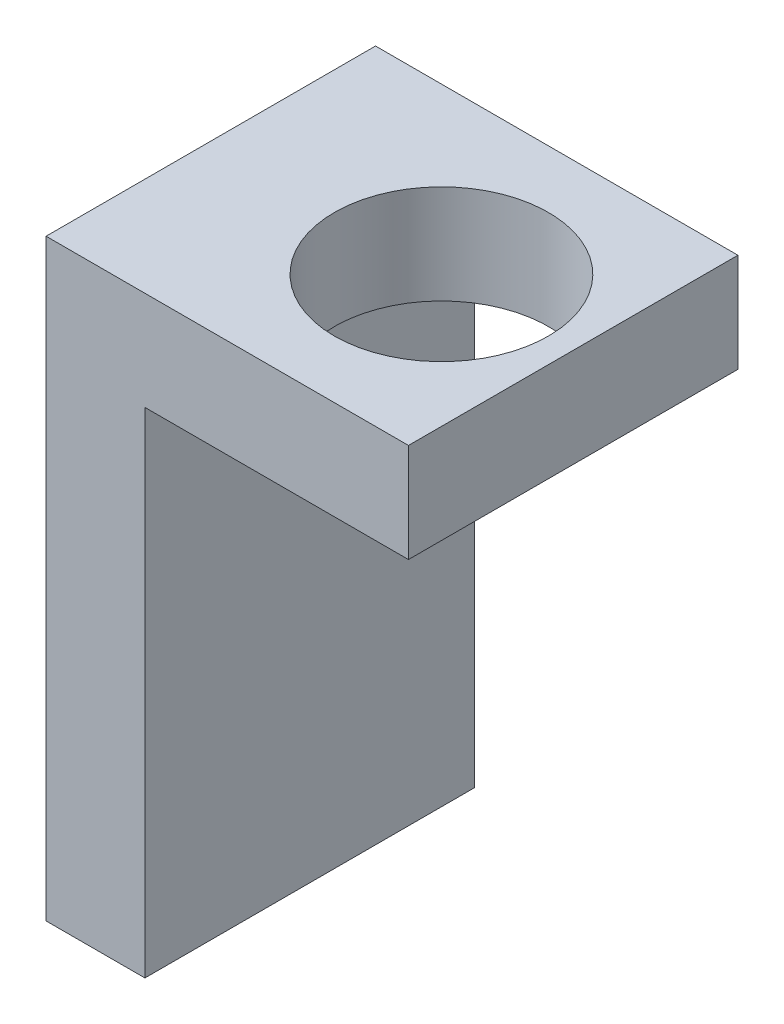
ISO-10303-21;
HEADER;
FILE_DESCRIPTION(('STEP AP214'),'2;1');
FILE_NAME('part.step','',(''),(''),'','','');
FILE_SCHEMA(('AUTOMOTIVE_DESIGN { 1 0 10303 214 1 1 1 1 }'));
ENDSEC;
DATA;
#1=APPLICATION_CONTEXT('core data for automotive mechanical design processes');
#2=APPLICATION_PROTOCOL_DEFINITION('international standard','automotive_design',2000,#1);
#3=PRODUCT_CONTEXT('',#1,'mechanical');
#4=PRODUCT('Part','Part','',(#3));
#5=PRODUCT_RELATED_PRODUCT_CATEGORY('part','',(#4));
#6=PRODUCT_DEFINITION_FORMATION('','',#4);
#7=PRODUCT_DEFINITION_CONTEXT('part definition',#1,'design');
#8=PRODUCT_DEFINITION('design','',#6,#7);
#9=PRODUCT_DEFINITION_SHAPE('','',#8);
#10=(LENGTH_UNIT() NAMED_UNIT(*) SI_UNIT(.MILLI.,.METRE.));
#11=(NAMED_UNIT(*) PLANE_ANGLE_UNIT() SI_UNIT($,.RADIAN.));
#12=(NAMED_UNIT(*) SI_UNIT($,.STERADIAN.) SOLID_ANGLE_UNIT());
#13=UNCERTAINTY_MEASURE_WITH_UNIT(LENGTH_MEASURE(1.E-05),#10,'distance_accuracy_value','');
#14=(GEOMETRIC_REPRESENTATION_CONTEXT(3) GLOBAL_UNCERTAINTY_ASSIGNED_CONTEXT((#13)) GLOBAL_UNIT_ASSIGNED_CONTEXT((#10,
#11,#12)) REPRESENTATION_CONTEXT('',''));
#15=CARTESIAN_POINT('',(0.,0.,0.));
#16=DIRECTION('',(0.,0.,1.));
#17=DIRECTION('',(1.,0.,0.));
#18=AXIS2_PLACEMENT_3D('',#15,#16,#17);
#19=CARTESIAN_POINT('',(5.5,-3.,0.));
#20=DIRECTION('',(-1.,0.,0.));
#21=DIRECTION('',(0.,0.,1.));
#22=AXIS2_PLACEMENT_3D('',#19,#20,#21);
#23=PLANE('',#22);
#24=DIRECTION('',(0.,0.,1.));
#25=VECTOR('',#24,1.);
#26=CARTESIAN_POINT('',(5.5,0.,0.));
#27=LINE('',#26,#25);
#28=CARTESIAN_POINT('',(5.5,0.,-5.));
#29=VERTEX_POINT('',#28);
#30=CARTESIAN_POINT('',(5.5,0.,5.));
#31=VERTEX_POINT('',#30);
#32=EDGE_CURVE('E102',#29,#31,#27,.T.);
#33=ORIENTED_EDGE('',*,*,#32,.T.);
#34=DIRECTION('',(0.,1.,0.));
#35=VECTOR('',#34,1.);
#36=CARTESIAN_POINT('',(5.5,-3.,5.));
#37=LINE('',#36,#35);
#38=CARTESIAN_POINT('',(5.5,-3.,5.));
#39=VERTEX_POINT('',#38);
#40=EDGE_CURVE('E11',#39,#31,#37,.T.);
#41=ORIENTED_EDGE('',*,*,#40,.F.);
#42=DIRECTION('',(0.,0.,1.));
#43=VECTOR('',#42,1.);
#44=CARTESIAN_POINT('',(5.5,-3.,0.));
#45=LINE('',#44,#43);
#46=CARTESIAN_POINT('',(5.5,-3.,-5.));
#47=VERTEX_POINT('',#46);
#48=EDGE_CURVE('E55',#47,#39,#45,.T.);
#49=ORIENTED_EDGE('',*,*,#48,.F.);
#50=DIRECTION('',(0.,1.,0.));
#51=VECTOR('',#50,1.);
#52=CARTESIAN_POINT('',(5.5,-3.,-5.));
#53=LINE('',#52,#51);
#54=EDGE_CURVE('E42',#47,#29,#53,.T.);
#55=ORIENTED_EDGE('',*,*,#54,.T.);
#56=EDGE_LOOP('',(#33,#41,#49,#55));
#57=FACE_BOUND('',#56,.T.);
#58=ADVANCED_FACE('F39',(#57),#23,.F.);
#59=CARTESIAN_POINT('',(0.,-3.,5.));
#60=DIRECTION('',(0.,0.,1.));
#61=DIRECTION('',(1.,0.,0.));
#62=AXIS2_PLACEMENT_3D('',#59,#60,#61);
#63=PLANE('',#62);
#64=DIRECTION('',(1.,0.,0.));
#65=VECTOR('',#64,1.);
#66=CARTESIAN_POINT('',(0.,0.,5.));
#67=LINE('',#66,#65);
#68=CARTESIAN_POINT('',(-5.5,0.,5.));
#69=VERTEX_POINT('',#68);
#70=EDGE_CURVE('E92',#69,#31,#67,.T.);
#71=ORIENTED_EDGE('',*,*,#70,.F.);
#72=DIRECTION('',(0.,1.,0.));
#73=VECTOR('',#72,1.);
#74=CARTESIAN_POINT('',(-5.5,-18.,5.));
#75=LINE('',#74,#73);
#76=CARTESIAN_POINT('',(-5.5,-18.,5.));
#77=VERTEX_POINT('',#76);
#78=EDGE_CURVE('E106',#77,#69,#75,.T.);
#79=ORIENTED_EDGE('',*,*,#78,.F.);
#80=DIRECTION('',(1.,0.,0.));
#81=VECTOR('',#80,1.);
#82=CARTESIAN_POINT('',(-5.5,-18.,5.));
#83=LINE('',#82,#81);
#84=CARTESIAN_POINT('',(-2.5,-18.,5.));
#85=VERTEX_POINT('',#84);
#86=EDGE_CURVE('E120',#77,#85,#83,.T.);
#87=ORIENTED_EDGE('',*,*,#86,.T.);
#88=DIRECTION('',(0.,1.,0.));
#89=VECTOR('',#88,1.);
#90=CARTESIAN_POINT('',(-2.5,-18.,5.));
#91=LINE('',#90,#89);
#92=CARTESIAN_POINT('',(-2.5,-3.,5.));
#93=VERTEX_POINT('',#92);
#94=EDGE_CURVE('E104',#85,#93,#91,.T.);
#95=ORIENTED_EDGE('',*,*,#94,.T.);
#96=DIRECTION('',(1.,0.,0.));
#97=VECTOR('',#96,1.);
#98=CARTESIAN_POINT('',(0.,-3.,5.));
#99=LINE('',#98,#97);
#100=EDGE_CURVE('E74',#93,#39,#99,.T.);
#101=ORIENTED_EDGE('',*,*,#100,.T.);
#102=ORIENTED_EDGE('',*,*,#40,.T.);
#103=EDGE_LOOP('',(#71,#79,#87,#95,#101,#102));
#104=FACE_BOUND('',#103,.T.);
#105=ADVANCED_FACE('F150',(#104),#63,.T.);
#106=CARTESIAN_POINT('',(0.,-3.,-5.));
#107=DIRECTION('',(0.,0.,1.));
#108=DIRECTION('',(1.,0.,0.));
#109=AXIS2_PLACEMENT_3D('',#106,#107,#108);
#110=PLANE('',#109);
#111=DIRECTION('',(1.,0.,0.));
#112=VECTOR('',#111,1.);
#113=CARTESIAN_POINT('',(0.,0.,-5.));
#114=LINE('',#113,#112);
#115=CARTESIAN_POINT('',(-5.5,0.,-5.));
#116=VERTEX_POINT('',#115);
#117=EDGE_CURVE('E68',#116,#29,#114,.T.);
#118=ORIENTED_EDGE('',*,*,#117,.T.);
#119=ORIENTED_EDGE('',*,*,#54,.F.);
#120=DIRECTION('',(1.,0.,0.));
#121=VECTOR('',#120,1.);
#122=CARTESIAN_POINT('',(0.,-3.,-5.));
#123=LINE('',#122,#121);
#124=CARTESIAN_POINT('',(-2.5,-3.,-5.));
#125=VERTEX_POINT('',#124);
#126=EDGE_CURVE('E82',#125,#47,#123,.T.);
#127=ORIENTED_EDGE('',*,*,#126,.F.);
#128=DIRECTION('',(0.,1.,0.));
#129=VECTOR('',#128,1.);
#130=CARTESIAN_POINT('',(-2.5,-18.,-5.));
#131=LINE('',#130,#129);
#132=CARTESIAN_POINT('',(-2.5,-18.,-5.));
#133=VERTEX_POINT('',#132);
#134=EDGE_CURVE('E97',#133,#125,#131,.T.);
#135=ORIENTED_EDGE('',*,*,#134,.F.);
#136=DIRECTION('',(-1.,0.,0.));
#137=VECTOR('',#136,1.);
#138=CARTESIAN_POINT('',(-2.5,-18.,-5.));
#139=LINE('',#138,#137);
#140=CARTESIAN_POINT('',(-5.5,-18.,-5.));
#141=VERTEX_POINT('',#140);
#142=EDGE_CURVE('E127',#133,#141,#139,.T.);
#143=ORIENTED_EDGE('',*,*,#142,.T.);
#144=DIRECTION('',(0.,1.,0.));
#145=VECTOR('',#144,1.);
#146=CARTESIAN_POINT('',(-5.5,-18.,-5.));
#147=LINE('',#146,#145);
#148=EDGE_CURVE('E111',#141,#116,#147,.T.);
#149=ORIENTED_EDGE('',*,*,#148,.T.);
#150=EDGE_LOOP('',(#118,#119,#127,#135,#143,#149));
#151=FACE_BOUND('',#150,.T.);
#152=ADVANCED_FACE('F88',(#151),#110,.F.);
#153=CARTESIAN_POINT('',(0.,-3.,0.));
#154=DIRECTION('',(0.,1.,0.));
#155=DIRECTION('',(0.,0.,1.));
#156=AXIS2_PLACEMENT_3D('',#153,#154,#155);
#157=PLANE('',#156);
#158=CARTESIAN_POINT('',(1.5,-3.,0.));
#159=DIRECTION('',(0.,1.,0.));
#160=DIRECTION('',(0.,0.,1.));
#161=AXIS2_PLACEMENT_3D('',#158,#159,#160);
#162=CIRCLE('',#161,3.25);
#163=CARTESIAN_POINT('',(1.5,-3.,3.25));
#164=VERTEX_POINT('',#163);
#165=EDGE_CURVE('E133',#164,#164,#162,.T.);
#166=ORIENTED_EDGE('',*,*,#165,.T.);
#167=EDGE_LOOP('',(#166));
#168=FACE_BOUND('',#167,.T.);
#169=ORIENTED_EDGE('',*,*,#48,.T.);
#170=ORIENTED_EDGE('',*,*,#100,.F.);
#171=DIRECTION('',(0.,0.,1.));
#172=VECTOR('',#171,1.);
#173=CARTESIAN_POINT('',(-2.5,-3.,0.));
#174=LINE('',#173,#172);
#175=EDGE_CURVE('E84',#125,#93,#174,.T.);
#176=ORIENTED_EDGE('',*,*,#175,.F.);
#177=ORIENTED_EDGE('',*,*,#126,.T.);
#178=EDGE_LOOP('',(#169,#170,#176,#177));
#179=FACE_BOUND('',#178,.T.);
#180=ADVANCED_FACE('F83',(#168,#179),#157,.F.);
#181=CARTESIAN_POINT('',(0.,0.,0.));
#182=DIRECTION('',(0.,1.,0.));
#183=DIRECTION('',(0.,0.,1.));
#184=AXIS2_PLACEMENT_3D('',#181,#182,#183);
#185=PLANE('',#184);
#186=CARTESIAN_POINT('',(1.5,0.,0.));
#187=DIRECTION('',(0.,1.,0.));
#188=DIRECTION('',(0.,0.,1.));
#189=AXIS2_PLACEMENT_3D('',#186,#187,#188);
#190=CIRCLE('',#189,3.25);
#191=CARTESIAN_POINT('',(1.5,0.,3.25));
#192=VERTEX_POINT('',#191);
#193=EDGE_CURVE('E136',#192,#192,#190,.T.);
#194=ORIENTED_EDGE('',*,*,#193,.F.);
#195=EDGE_LOOP('',(#194));
#196=FACE_BOUND('',#195,.T.);
#197=ORIENTED_EDGE('',*,*,#32,.F.);
#198=ORIENTED_EDGE('',*,*,#117,.F.);
#199=DIRECTION('',(0.,0.,1.));
#200=VECTOR('',#199,1.);
#201=CARTESIAN_POINT('',(-5.5,0.,-5.));
#202=LINE('',#201,#200);
#203=EDGE_CURVE('E114',#116,#69,#202,.T.);
#204=ORIENTED_EDGE('',*,*,#203,.T.);
#205=ORIENTED_EDGE('',*,*,#70,.T.);
#206=EDGE_LOOP('',(#197,#198,#204,#205));
#207=FACE_BOUND('',#206,.T.);
#208=ADVANCED_FACE('F143',(#196,#207),#185,.T.);
#209=CARTESIAN_POINT('',(-2.5,-18.,5.));
#210=DIRECTION('',(1.,0.,0.));
#211=DIRECTION('',(0.,0.,-1.));
#212=AXIS2_PLACEMENT_3D('',#209,#210,#211);
#213=PLANE('',#212);
#214=ORIENTED_EDGE('',*,*,#134,.T.);
#215=ORIENTED_EDGE('',*,*,#175,.T.);
#216=ORIENTED_EDGE('',*,*,#94,.F.);
#217=DIRECTION('',(0.,0.,-1.));
#218=VECTOR('',#217,1.);
#219=CARTESIAN_POINT('',(-2.5,-18.,5.));
#220=LINE('',#219,#218);
#221=EDGE_CURVE('E131',#85,#133,#220,.T.);
#222=ORIENTED_EDGE('',*,*,#221,.T.);
#223=EDGE_LOOP('',(#214,#215,#216,#222));
#224=FACE_BOUND('',#223,.T.);
#225=ADVANCED_FACE('F146',(#224),#213,.T.);
#226=CARTESIAN_POINT('',(-5.5,-18.,-5.));
#227=DIRECTION('',(-1.,0.,0.));
#228=DIRECTION('',(0.,0.,1.));
#229=AXIS2_PLACEMENT_3D('',#226,#227,#228);
#230=PLANE('',#229);
#231=ORIENTED_EDGE('',*,*,#203,.F.);
#232=ORIENTED_EDGE('',*,*,#148,.F.);
#233=DIRECTION('',(0.,0.,1.));
#234=VECTOR('',#233,1.);
#235=CARTESIAN_POINT('',(-5.5,-18.,-5.));
#236=LINE('',#235,#234);
#237=EDGE_CURVE('E123',#141,#77,#236,.T.);
#238=ORIENTED_EDGE('',*,*,#237,.T.);
#239=ORIENTED_EDGE('',*,*,#78,.T.);
#240=EDGE_LOOP('',(#231,#232,#238,#239));
#241=FACE_BOUND('',#240,.T.);
#242=ADVANCED_FACE('F153',(#241),#230,.T.);
#243=CARTESIAN_POINT('',(0.,-18.,0.));
#244=DIRECTION('',(0.,1.,0.));
#245=DIRECTION('',(0.,0.,1.));
#246=AXIS2_PLACEMENT_3D('',#243,#244,#245);
#247=PLANE('',#246);
#248=ORIENTED_EDGE('',*,*,#221,.F.);
#249=ORIENTED_EDGE('',*,*,#86,.F.);
#250=ORIENTED_EDGE('',*,*,#237,.F.);
#251=ORIENTED_EDGE('',*,*,#142,.F.);
#252=EDGE_LOOP('',(#248,#249,#250,#251));
#253=FACE_BOUND('',#252,.T.);
#254=ADVANCED_FACE('F160',(#253),#247,.F.);
#255=CARTESIAN_POINT('',(1.5,-3.2,0.));
#256=DIRECTION('',(0.,1.,0.));
#257=DIRECTION('',(0.,0.,1.));
#258=AXIS2_PLACEMENT_3D('',#255,#256,#257);
#259=CYLINDRICAL_SURFACE('',#258,3.25);
#260=ORIENTED_EDGE('',*,*,#193,.T.);
#261=EDGE_LOOP('',(#260));
#262=FACE_BOUND('',#261,.T.);
#263=ORIENTED_EDGE('',*,*,#165,.F.);
#264=EDGE_LOOP('',(#263));
#265=FACE_BOUND('',#264,.T.);
#266=ADVANCED_FACE('F140',(#262,#265),#259,.F.);
#267=CLOSED_SHELL('',(#58,#105,#152,#180,#208,#225,#242,#254,#266));
#268=MANIFOLD_SOLID_BREP('B2',#267);
#269=ADVANCED_BREP_SHAPE_REPRESENTATION('',(#18,#268),#14);
#270=SHAPE_DEFINITION_REPRESENTATION(#9,#269);
ENDSEC;
END-ISO-10303-21;
